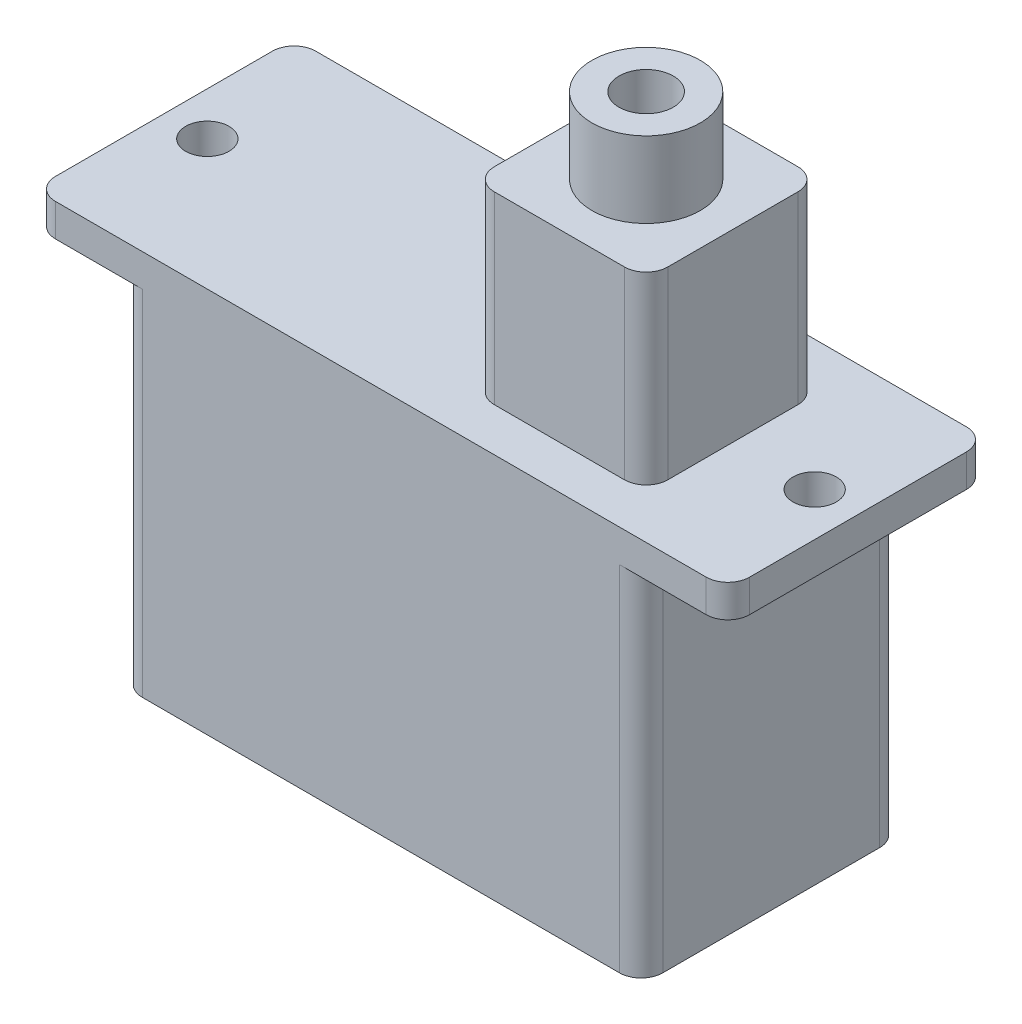
ISO-10303-21;
HEADER;
FILE_DESCRIPTION(('STEP AP214'),'2;1');
FILE_NAME('part.step','',(''),(''),'','','');
FILE_SCHEMA(('AUTOMOTIVE_DESIGN { 1 0 10303 214 1 1 1 1 }'));
ENDSEC;
DATA;
#1=APPLICATION_CONTEXT('core data for automotive mechanical design processes');
#2=APPLICATION_PROTOCOL_DEFINITION('international standard','automotive_design',2000,#1);
#3=PRODUCT_CONTEXT('',#1,'mechanical');
#4=PRODUCT('Part','Part','',(#3));
#5=PRODUCT_RELATED_PRODUCT_CATEGORY('part','',(#4));
#6=PRODUCT_DEFINITION_FORMATION('','',#4);
#7=PRODUCT_DEFINITION_CONTEXT('part definition',#1,'design');
#8=PRODUCT_DEFINITION('design','',#6,#7);
#9=PRODUCT_DEFINITION_SHAPE('','',#8);
#10=(LENGTH_UNIT() NAMED_UNIT(*) SI_UNIT(.MILLI.,.METRE.));
#11=(NAMED_UNIT(*) PLANE_ANGLE_UNIT() SI_UNIT($,.RADIAN.));
#12=(NAMED_UNIT(*) SI_UNIT($,.STERADIAN.) SOLID_ANGLE_UNIT());
#13=UNCERTAINTY_MEASURE_WITH_UNIT(LENGTH_MEASURE(1.E-05),#10,'distance_accuracy_value','');
#14=(GEOMETRIC_REPRESENTATION_CONTEXT(3) GLOBAL_UNCERTAINTY_ASSIGNED_CONTEXT((#13)) GLOBAL_UNIT_ASSIGNED_CONTEXT((#10,
#11,#12)) REPRESENTATION_CONTEXT('',''));
#15=CARTESIAN_POINT('',(0.,0.,0.));
#16=DIRECTION('',(0.,0.,1.));
#17=DIRECTION('',(1.,0.,0.));
#18=AXIS2_PLACEMENT_3D('',#15,#16,#17);
#19=CARTESIAN_POINT('',(12.,16.3,-6.));
#20=DIRECTION('',(-1.,0.,0.));
#21=DIRECTION('',(0.,0.,1.));
#22=AXIS2_PLACEMENT_3D('',#19,#20,#21);
#23=PLANE('',#22);
#24=DIRECTION('',(0.,0.,-1.));
#25=VECTOR('',#24,1.);
#26=CARTESIAN_POINT('',(12.,0.,-6.));
#27=LINE('',#26,#25);
#28=CARTESIAN_POINT('',(12.,0.,5.));
#29=VERTEX_POINT('',#28);
#30=CARTESIAN_POINT('',(12.,0.,-5.));
#31=VERTEX_POINT('',#30);
#32=EDGE_CURVE('E348',#29,#31,#27,.T.);
#33=ORIENTED_EDGE('',*,*,#32,.T.);
#34=DIRECTION('',(0.,-1.,0.));
#35=VECTOR('',#34,1.);
#36=CARTESIAN_POINT('',(12.,16.3,-5.));
#37=LINE('',#36,#35);
#38=CARTESIAN_POINT('',(12.,16.3,-5.));
#39=VERTEX_POINT('',#38);
#40=EDGE_CURVE('E58',#31,#39,#37,.F.);
#41=ORIENTED_EDGE('',*,*,#40,.T.);
#42=DIRECTION('',(0.,0.,-1.));
#43=VECTOR('',#42,1.);
#44=CARTESIAN_POINT('',(12.,16.3,-6.));
#45=LINE('',#44,#43);
#46=CARTESIAN_POINT('',(12.,16.3,5.));
#47=VERTEX_POINT('',#46);
#48=EDGE_CURVE('E338',#47,#39,#45,.T.);
#49=ORIENTED_EDGE('',*,*,#48,.F.);
#50=DIRECTION('',(0.,-1.,0.));
#51=VECTOR('',#50,1.);
#52=CARTESIAN_POINT('',(12.,16.3,5.));
#53=LINE('',#52,#51);
#54=EDGE_CURVE('E325',#47,#29,#53,.T.);
#55=ORIENTED_EDGE('',*,*,#54,.T.);
#56=EDGE_LOOP('',(#33,#41,#49,#55));
#57=FACE_BOUND('',#56,.T.);
#58=ADVANCED_FACE('F43',(#57),#23,.F.);
#59=CARTESIAN_POINT('',(-12.,16.3,-6.));
#60=DIRECTION('',(0.,0.,1.));
#61=DIRECTION('',(1.,0.,0.));
#62=AXIS2_PLACEMENT_3D('',#59,#60,#61);
#63=PLANE('',#62);
#64=DIRECTION('',(-1.,0.,0.));
#65=VECTOR('',#64,1.);
#66=CARTESIAN_POINT('',(-12.,0.,-6.));
#67=LINE('',#66,#65);
#68=CARTESIAN_POINT('',(11.,0.,-6.));
#69=VERTEX_POINT('',#68);
#70=CARTESIAN_POINT('',(-11.,0.,-6.));
#71=VERTEX_POINT('',#70);
#72=EDGE_CURVE('E342',#69,#71,#67,.T.);
#73=ORIENTED_EDGE('',*,*,#72,.T.);
#74=DIRECTION('',(0.,-1.,0.));
#75=VECTOR('',#74,1.);
#76=CARTESIAN_POINT('',(-11.,16.3,-6.));
#77=LINE('',#76,#75);
#78=CARTESIAN_POINT('',(-11.,16.3,-6.));
#79=VERTEX_POINT('',#78);
#80=EDGE_CURVE('E223',#71,#79,#77,.F.);
#81=ORIENTED_EDGE('',*,*,#80,.T.);
#82=DIRECTION('',(-1.,0.,0.));
#83=VECTOR('',#82,1.);
#84=CARTESIAN_POINT('',(0.,16.3,-6.));
#85=LINE('',#84,#83);
#86=CARTESIAN_POINT('',(-15.,16.3,-6.));
#87=VERTEX_POINT('',#86);
#88=EDGE_CURVE('E205',#79,#87,#85,.T.);
#89=ORIENTED_EDGE('',*,*,#88,.T.);
#90=DIRECTION('',(0.,-1.,0.));
#91=VECTOR('',#90,1.);
#92=CARTESIAN_POINT('',(-15.,16.3,-6.));
#93=LINE('',#92,#91);
#94=CARTESIAN_POINT('',(-15.,17.8,-6.));
#95=VERTEX_POINT('',#94);
#96=EDGE_CURVE('E220',#87,#95,#93,.F.);
#97=ORIENTED_EDGE('',*,*,#96,.T.);
#98=DIRECTION('',(-1.,0.,0.));
#99=VECTOR('',#98,1.);
#100=CARTESIAN_POINT('',(0.,17.8,-6.));
#101=LINE('',#100,#99);
#102=CARTESIAN_POINT('',(15.,17.8,-6.));
#103=VERTEX_POINT('',#102);
#104=EDGE_CURVE('E391',#103,#95,#101,.T.);
#105=ORIENTED_EDGE('',*,*,#104,.F.);
#106=DIRECTION('',(0.,-1.,0.));
#107=VECTOR('',#106,1.);
#108=CARTESIAN_POINT('',(15.,16.3,-6.));
#109=LINE('',#108,#107);
#110=CARTESIAN_POINT('',(15.,16.3,-6.));
#111=VERTEX_POINT('',#110);
#112=EDGE_CURVE('E231',#103,#111,#109,.T.);
#113=ORIENTED_EDGE('',*,*,#112,.T.);
#114=CARTESIAN_POINT('',(11.,16.3,-6.));
#115=VERTEX_POINT('',#114);
#116=EDGE_CURVE('E225',#111,#115,#85,.T.);
#117=ORIENTED_EDGE('',*,*,#116,.T.);
#118=DIRECTION('',(0.,-1.,0.));
#119=VECTOR('',#118,1.);
#120=CARTESIAN_POINT('',(11.,16.3,-6.));
#121=LINE('',#120,#119);
#122=EDGE_CURVE('E315',#115,#69,#121,.T.);
#123=ORIENTED_EDGE('',*,*,#122,.T.);
#124=EDGE_LOOP('',(#73,#81,#89,#97,#105,#113,#117,#123));
#125=FACE_BOUND('',#124,.T.);
#126=ADVANCED_FACE('F218',(#125),#63,.F.);
#127=CARTESIAN_POINT('',(-12.,16.3,-6.));
#128=DIRECTION('',(1.,0.,0.));
#129=DIRECTION('',(0.,0.,-1.));
#130=AXIS2_PLACEMENT_3D('',#127,#128,#129);
#131=PLANE('',#130);
#132=DIRECTION('',(0.,0.,1.));
#133=VECTOR('',#132,1.);
#134=CARTESIAN_POINT('',(-12.,16.3,-6.));
#135=LINE('',#134,#133);
#136=CARTESIAN_POINT('',(-12.,16.3,-5.));
#137=VERTEX_POINT('',#136);
#138=CARTESIAN_POINT('',(-12.,16.3,5.));
#139=VERTEX_POINT('',#138);
#140=EDGE_CURVE('E238',#137,#139,#135,.T.);
#141=ORIENTED_EDGE('',*,*,#140,.F.);
#142=DIRECTION('',(0.,-1.,0.));
#143=VECTOR('',#142,1.);
#144=CARTESIAN_POINT('',(-12.,16.3,-5.));
#145=LINE('',#144,#143);
#146=CARTESIAN_POINT('',(-12.,0.,-5.));
#147=VERTEX_POINT('',#146);
#148=EDGE_CURVE('E304',#137,#147,#145,.T.);
#149=ORIENTED_EDGE('',*,*,#148,.T.);
#150=DIRECTION('',(0.,0.,1.));
#151=VECTOR('',#150,1.);
#152=CARTESIAN_POINT('',(-12.,0.,-6.));
#153=LINE('',#152,#151);
#154=CARTESIAN_POINT('',(-12.,0.,5.));
#155=VERTEX_POINT('',#154);
#156=EDGE_CURVE('E347',#147,#155,#153,.T.);
#157=ORIENTED_EDGE('',*,*,#156,.T.);
#158=DIRECTION('',(0.,-1.,0.));
#159=VECTOR('',#158,1.);
#160=CARTESIAN_POINT('',(-12.,16.3,5.));
#161=LINE('',#160,#159);
#162=EDGE_CURVE('E302',#155,#139,#161,.F.);
#163=ORIENTED_EDGE('',*,*,#162,.T.);
#164=EDGE_LOOP('',(#141,#149,#157,#163));
#165=FACE_BOUND('',#164,.T.);
#166=ADVANCED_FACE('F444',(#165),#131,.F.);
#167=CARTESIAN_POINT('',(-12.,16.3,6.));
#168=DIRECTION('',(0.,0.,-1.));
#169=DIRECTION('',(-1.,0.,0.));
#170=AXIS2_PLACEMENT_3D('',#167,#168,#169);
#171=PLANE('',#170);
#172=DIRECTION('',(1.,0.,0.));
#173=VECTOR('',#172,1.);
#174=CARTESIAN_POINT('',(0.,16.3,6.));
#175=LINE('',#174,#173);
#176=CARTESIAN_POINT('',(-15.,16.3,6.));
#177=VERTEX_POINT('',#176);
#178=CARTESIAN_POINT('',(-11.,16.3,6.));
#179=VERTEX_POINT('',#178);
#180=EDGE_CURVE('E413',#177,#179,#175,.T.);
#181=ORIENTED_EDGE('',*,*,#180,.T.);
#182=DIRECTION('',(0.,-1.,0.));
#183=VECTOR('',#182,1.);
#184=CARTESIAN_POINT('',(-11.,16.3,6.));
#185=LINE('',#184,#183);
#186=CARTESIAN_POINT('',(-11.,0.,6.));
#187=VERTEX_POINT('',#186);
#188=EDGE_CURVE('E322',#179,#187,#185,.T.);
#189=ORIENTED_EDGE('',*,*,#188,.T.);
#190=DIRECTION('',(1.,0.,0.));
#191=VECTOR('',#190,1.);
#192=CARTESIAN_POINT('',(-12.,0.,6.));
#193=LINE('',#192,#191);
#194=CARTESIAN_POINT('',(11.,0.,6.));
#195=VERTEX_POINT('',#194);
#196=EDGE_CURVE('E351',#187,#195,#193,.T.);
#197=ORIENTED_EDGE('',*,*,#196,.T.);
#198=DIRECTION('',(0.,-1.,0.));
#199=VECTOR('',#198,1.);
#200=CARTESIAN_POINT('',(11.,16.3,6.));
#201=LINE('',#200,#199);
#202=CARTESIAN_POINT('',(11.,16.3,6.));
#203=VERTEX_POINT('',#202);
#204=EDGE_CURVE('E319',#195,#203,#201,.F.);
#205=ORIENTED_EDGE('',*,*,#204,.T.);
#206=CARTESIAN_POINT('',(15.,16.3,6.));
#207=VERTEX_POINT('',#206);
#208=EDGE_CURVE('E383',#203,#207,#175,.T.);
#209=ORIENTED_EDGE('',*,*,#208,.T.);
#210=DIRECTION('',(0.,-1.,0.));
#211=VECTOR('',#210,1.);
#212=CARTESIAN_POINT('',(15.,17.8,6.));
#213=LINE('',#212,#211);
#214=CARTESIAN_POINT('',(15.,17.8,6.));
#215=VERTEX_POINT('',#214);
#216=EDGE_CURVE('E260',#207,#215,#213,.F.);
#217=ORIENTED_EDGE('',*,*,#216,.T.);
#218=DIRECTION('',(1.,0.,0.));
#219=VECTOR('',#218,1.);
#220=CARTESIAN_POINT('',(0.,17.8,6.));
#221=LINE('',#220,#219);
#222=CARTESIAN_POINT('',(-15.,17.8,6.));
#223=VERTEX_POINT('',#222);
#224=EDGE_CURVE('E384',#223,#215,#221,.T.);
#225=ORIENTED_EDGE('',*,*,#224,.F.);
#226=DIRECTION('',(0.,-1.,0.));
#227=VECTOR('',#226,1.);
#228=CARTESIAN_POINT('',(-15.,16.3,6.));
#229=LINE('',#228,#227);
#230=EDGE_CURVE('E257',#223,#177,#229,.T.);
#231=ORIENTED_EDGE('',*,*,#230,.T.);
#232=EDGE_LOOP('',(#181,#189,#197,#205,#209,#217,#225,#231));
#233=FACE_BOUND('',#232,.T.);
#234=ADVANCED_FACE('F435',(#233),#171,.F.);
#235=CARTESIAN_POINT('',(0.,0.,0.));
#236=DIRECTION('',(0.,1.,0.));
#237=DIRECTION('',(0.,0.,1.));
#238=AXIS2_PLACEMENT_3D('',#235,#236,#237);
#239=PLANE('',#238);
#240=ORIENTED_EDGE('',*,*,#156,.F.);
#241=CARTESIAN_POINT('',(-11.,0.,-5.));
#242=DIRECTION('',(0.,1.,0.));
#243=DIRECTION('',(0.,0.,1.));
#244=AXIS2_PLACEMENT_3D('',#241,#242,#243);
#245=CIRCLE('',#244,1.);
#246=EDGE_CURVE('E313',#147,#71,#245,.F.);
#247=ORIENTED_EDGE('',*,*,#246,.T.);
#248=ORIENTED_EDGE('',*,*,#72,.F.);
#249=CARTESIAN_POINT('',(11.,0.,-5.));
#250=DIRECTION('',(0.,1.,0.));
#251=DIRECTION('',(0.,0.,1.));
#252=AXIS2_PLACEMENT_3D('',#249,#250,#251);
#253=CIRCLE('',#252,1.);
#254=EDGE_CURVE('E309',#69,#31,#253,.F.);
#255=ORIENTED_EDGE('',*,*,#254,.T.);
#256=ORIENTED_EDGE('',*,*,#32,.F.);
#257=CARTESIAN_POINT('',(11.,0.,5.));
#258=DIRECTION('',(0.,1.,0.));
#259=DIRECTION('',(0.,0.,1.));
#260=AXIS2_PLACEMENT_3D('',#257,#258,#259);
#261=CIRCLE('',#260,1.);
#262=EDGE_CURVE('E307',#29,#195,#261,.F.);
#263=ORIENTED_EDGE('',*,*,#262,.T.);
#264=ORIENTED_EDGE('',*,*,#196,.F.);
#265=CARTESIAN_POINT('',(-11.,0.,5.));
#266=DIRECTION('',(0.,1.,0.));
#267=DIRECTION('',(0.,0.,1.));
#268=AXIS2_PLACEMENT_3D('',#265,#266,#267);
#269=CIRCLE('',#268,1.);
#270=EDGE_CURVE('E311',#187,#155,#269,.F.);
#271=ORIENTED_EDGE('',*,*,#270,.T.);
#272=EDGE_LOOP('',(#240,#247,#248,#255,#256,#263,#264,#271));
#273=FACE_BOUND('',#272,.T.);
#274=ADVANCED_FACE('F345',(#273),#239,.F.);
#275=CARTESIAN_POINT('',(0.,16.3,0.));
#276=DIRECTION('',(0.,1.,0.));
#277=DIRECTION('',(0.,0.,1.));
#278=AXIS2_PLACEMENT_3D('',#275,#276,#277);
#279=PLANE('',#278);
#280=CARTESIAN_POINT('',(14.,16.3,0.));
#281=DIRECTION('',(0.,1.,0.));
#282=DIRECTION('',(0.,0.,1.));
#283=AXIS2_PLACEMENT_3D('',#280,#281,#282);
#284=CIRCLE('',#283,1.);
#285=CARTESIAN_POINT('',(14.,16.3,1.));
#286=VERTEX_POINT('',#285);
#287=EDGE_CURVE('E388',#286,#286,#284,.T.);
#288=ORIENTED_EDGE('',*,*,#287,.T.);
#289=EDGE_LOOP('',(#288));
#290=FACE_BOUND('',#289,.T.);
#291=ORIENTED_EDGE('',*,*,#116,.F.);
#292=CARTESIAN_POINT('',(15.,16.3,-5.));
#293=DIRECTION('',(0.,1.,0.));
#294=DIRECTION('',(0.,0.,1.));
#295=AXIS2_PLACEMENT_3D('',#292,#293,#294);
#296=CIRCLE('',#295,1.);
#297=CARTESIAN_POINT('',(16.,16.3,-5.));
#298=VERTEX_POINT('',#297);
#299=EDGE_CURVE('E243',#111,#298,#296,.F.);
#300=ORIENTED_EDGE('',*,*,#299,.T.);
#301=DIRECTION('',(0.,0.,1.));
#302=VECTOR('',#301,1.);
#303=CARTESIAN_POINT('',(16.,16.3,0.));
#304=LINE('',#303,#302);
#305=CARTESIAN_POINT('',(16.,16.3,5.));
#306=VERTEX_POINT('',#305);
#307=EDGE_CURVE('E226',#298,#306,#304,.T.);
#308=ORIENTED_EDGE('',*,*,#307,.T.);
#309=CARTESIAN_POINT('',(15.,16.3,5.));
#310=DIRECTION('',(0.,1.,0.));
#311=DIRECTION('',(0.,0.,1.));
#312=AXIS2_PLACEMENT_3D('',#309,#310,#311);
#313=CIRCLE('',#312,1.);
#314=EDGE_CURVE('E235',#306,#207,#313,.F.);
#315=ORIENTED_EDGE('',*,*,#314,.T.);
#316=ORIENTED_EDGE('',*,*,#208,.F.);
#317=CARTESIAN_POINT('',(11.,16.3,5.));
#318=DIRECTION('',(0.,1.,0.));
#319=DIRECTION('',(0.,0.,1.));
#320=AXIS2_PLACEMENT_3D('',#317,#318,#319);
#321=CIRCLE('',#320,1.);
#322=EDGE_CURVE('E11',#203,#47,#321,.T.);
#323=ORIENTED_EDGE('',*,*,#322,.T.);
#324=ORIENTED_EDGE('',*,*,#48,.T.);
#325=CARTESIAN_POINT('',(11.,16.3,-5.));
#326=DIRECTION('',(0.,1.,0.));
#327=DIRECTION('',(0.,0.,1.));
#328=AXIS2_PLACEMENT_3D('',#325,#326,#327);
#329=CIRCLE('',#328,1.);
#330=EDGE_CURVE('E51',#39,#115,#329,.T.);
#331=ORIENTED_EDGE('',*,*,#330,.T.);
#332=EDGE_LOOP('',(#291,#300,#308,#315,#316,#323,#324,#331));
#333=FACE_BOUND('',#332,.T.);
#334=ADVANCED_FACE('F337',(#290,#333),#279,.F.);
#335=CARTESIAN_POINT('',(-14.,16.3,0.));
#336=DIRECTION('',(0.,1.,0.));
#337=DIRECTION('',(0.,0.,1.));
#338=AXIS2_PLACEMENT_3D('',#335,#336,#337);
#339=CIRCLE('',#338,1.);
#340=CARTESIAN_POINT('',(-14.,16.3,1.));
#341=VERTEX_POINT('',#340);
#342=EDGE_CURVE('E418',#341,#341,#339,.T.);
#343=ORIENTED_EDGE('',*,*,#342,.T.);
#344=EDGE_LOOP('',(#343));
#345=FACE_BOUND('',#344,.T.);
#346=DIRECTION('',(0.,0.,1.));
#347=VECTOR('',#346,1.);
#348=CARTESIAN_POINT('',(-16.,16.3,0.));
#349=LINE('',#348,#347);
#350=CARTESIAN_POINT('',(-16.,16.3,-5.));
#351=VERTEX_POINT('',#350);
#352=CARTESIAN_POINT('',(-16.,16.3,5.));
#353=VERTEX_POINT('',#352);
#354=EDGE_CURVE('E208',#351,#353,#349,.T.);
#355=ORIENTED_EDGE('',*,*,#354,.F.);
#356=CARTESIAN_POINT('',(-15.,16.3,-5.));
#357=DIRECTION('',(0.,1.,0.));
#358=DIRECTION('',(0.,0.,1.));
#359=AXIS2_PLACEMENT_3D('',#356,#357,#358);
#360=CIRCLE('',#359,1.);
#361=EDGE_CURVE('E202',#351,#87,#360,.F.);
#362=ORIENTED_EDGE('',*,*,#361,.T.);
#363=ORIENTED_EDGE('',*,*,#88,.F.);
#364=CARTESIAN_POINT('',(-11.,16.3,-5.));
#365=DIRECTION('',(0.,1.,0.));
#366=DIRECTION('',(0.,0.,1.));
#367=AXIS2_PLACEMENT_3D('',#364,#365,#366);
#368=CIRCLE('',#367,1.);
#369=EDGE_CURVE('E329',#79,#137,#368,.T.);
#370=ORIENTED_EDGE('',*,*,#369,.T.);
#371=ORIENTED_EDGE('',*,*,#140,.T.);
#372=CARTESIAN_POINT('',(-11.,16.3,5.));
#373=DIRECTION('',(0.,1.,0.));
#374=DIRECTION('',(0.,0.,1.));
#375=AXIS2_PLACEMENT_3D('',#372,#373,#374);
#376=CIRCLE('',#375,1.);
#377=EDGE_CURVE('E331',#139,#179,#376,.T.);
#378=ORIENTED_EDGE('',*,*,#377,.T.);
#379=ORIENTED_EDGE('',*,*,#180,.F.);
#380=CARTESIAN_POINT('',(-15.,16.3,5.));
#381=DIRECTION('',(0.,1.,0.));
#382=DIRECTION('',(0.,0.,1.));
#383=AXIS2_PLACEMENT_3D('',#380,#381,#382);
#384=CIRCLE('',#383,1.);
#385=EDGE_CURVE('E214',#177,#353,#384,.F.);
#386=ORIENTED_EDGE('',*,*,#385,.T.);
#387=EDGE_LOOP('',(#355,#362,#363,#370,#371,#378,#379,#386));
#388=FACE_BOUND('',#387,.T.);
#389=ADVANCED_FACE('F204',(#345,#388),#279,.F.);
#390=CARTESIAN_POINT('',(16.,17.8,0.));
#391=DIRECTION('',(1.,0.,0.));
#392=DIRECTION('',(0.,0.,-1.));
#393=AXIS2_PLACEMENT_3D('',#390,#391,#392);
#394=PLANE('',#393);
#395=ORIENTED_EDGE('',*,*,#307,.F.);
#396=DIRECTION('',(0.,-1.,0.));
#397=VECTOR('',#396,1.);
#398=CARTESIAN_POINT('',(16.,17.8,-5.));
#399=LINE('',#398,#397);
#400=CARTESIAN_POINT('',(16.,17.8,-5.));
#401=VERTEX_POINT('',#400);
#402=EDGE_CURVE('E248',#298,#401,#399,.F.);
#403=ORIENTED_EDGE('',*,*,#402,.T.);
#404=DIRECTION('',(0.,0.,1.));
#405=VECTOR('',#404,1.);
#406=CARTESIAN_POINT('',(16.,17.8,0.));
#407=LINE('',#406,#405);
#408=CARTESIAN_POINT('',(16.,17.8,5.));
#409=VERTEX_POINT('',#408);
#410=EDGE_CURVE('E387',#401,#409,#407,.T.);
#411=ORIENTED_EDGE('',*,*,#410,.T.);
#412=DIRECTION('',(0.,-1.,0.));
#413=VECTOR('',#412,1.);
#414=CARTESIAN_POINT('',(16.,16.3,5.));
#415=LINE('',#414,#413);
#416=EDGE_CURVE('E245',#409,#306,#415,.T.);
#417=ORIENTED_EDGE('',*,*,#416,.T.);
#418=EDGE_LOOP('',(#395,#403,#411,#417));
#419=FACE_BOUND('',#418,.T.);
#420=ADVANCED_FACE('F684',(#419),#394,.T.);
#421=CARTESIAN_POINT('',(-14.,17.8,0.));
#422=DIRECTION('',(0.,-1.,0.));
#423=DIRECTION('',(0.,0.,-1.));
#424=AXIS2_PLACEMENT_3D('',#421,#422,#423);
#425=CYLINDRICAL_SURFACE('',#424,1.);
#426=CARTESIAN_POINT('',(-14.,17.8,0.));
#427=DIRECTION('',(0.,1.,0.));
#428=DIRECTION('',(0.,0.,1.));
#429=AXIS2_PLACEMENT_3D('',#426,#427,#428);
#430=CIRCLE('',#429,1.);
#431=CARTESIAN_POINT('',(-14.,17.8,1.));
#432=VERTEX_POINT('',#431);
#433=EDGE_CURVE('E408',#432,#432,#430,.T.);
#434=ORIENTED_EDGE('',*,*,#433,.T.);
#435=EDGE_LOOP('',(#434));
#436=FACE_BOUND('',#435,.T.);
#437=ORIENTED_EDGE('',*,*,#342,.F.);
#438=EDGE_LOOP('',(#437));
#439=FACE_BOUND('',#438,.T.);
#440=ADVANCED_FACE('F675',(#436,#439),#425,.F.);
#441=CARTESIAN_POINT('',(-16.,17.8,0.));
#442=DIRECTION('',(1.,0.,0.));
#443=DIRECTION('',(0.,0.,-1.));
#444=AXIS2_PLACEMENT_3D('',#441,#442,#443);
#445=PLANE('',#444);
#446=DIRECTION('',(0.,0.,1.));
#447=VECTOR('',#446,1.);
#448=CARTESIAN_POINT('',(-16.,17.8,0.));
#449=LINE('',#448,#447);
#450=CARTESIAN_POINT('',(-16.,17.8,-5.));
#451=VERTEX_POINT('',#450);
#452=CARTESIAN_POINT('',(-16.,17.8,5.));
#453=VERTEX_POINT('',#452);
#454=EDGE_CURVE('E393',#451,#453,#449,.T.);
#455=ORIENTED_EDGE('',*,*,#454,.F.);
#456=DIRECTION('',(0.,-1.,0.));
#457=VECTOR('',#456,1.);
#458=CARTESIAN_POINT('',(-16.,17.8,-5.));
#459=LINE('',#458,#457);
#460=EDGE_CURVE('E264',#451,#351,#459,.T.);
#461=ORIENTED_EDGE('',*,*,#460,.T.);
#462=ORIENTED_EDGE('',*,*,#354,.T.);
#463=DIRECTION('',(0.,-1.,0.));
#464=VECTOR('',#463,1.);
#465=CARTESIAN_POINT('',(-16.,17.8,5.));
#466=LINE('',#465,#464);
#467=EDGE_CURVE('E262',#353,#453,#466,.F.);
#468=ORIENTED_EDGE('',*,*,#467,.T.);
#469=EDGE_LOOP('',(#455,#461,#462,#468));
#470=FACE_BOUND('',#469,.T.);
#471=ADVANCED_FACE('F665',(#470),#445,.F.);
#472=CARTESIAN_POINT('',(14.,17.8,0.));
#473=DIRECTION('',(0.,-1.,0.));
#474=DIRECTION('',(0.,0.,-1.));
#475=AXIS2_PLACEMENT_3D('',#472,#473,#474);
#476=CYLINDRICAL_SURFACE('',#475,1.);
#477=CARTESIAN_POINT('',(14.,17.8,0.));
#478=DIRECTION('',(0.,1.,0.));
#479=DIRECTION('',(0.,0.,1.));
#480=AXIS2_PLACEMENT_3D('',#477,#478,#479);
#481=CIRCLE('',#480,1.);
#482=CARTESIAN_POINT('',(14.,17.8,1.));
#483=VERTEX_POINT('',#482);
#484=EDGE_CURVE('E353',#483,#483,#481,.T.);
#485=ORIENTED_EDGE('',*,*,#484,.T.);
#486=EDGE_LOOP('',(#485));
#487=FACE_BOUND('',#486,.T.);
#488=ORIENTED_EDGE('',*,*,#287,.F.);
#489=EDGE_LOOP('',(#488));
#490=FACE_BOUND('',#489,.T.);
#491=ADVANCED_FACE('F656',(#487,#490),#476,.F.);
#492=CARTESIAN_POINT('',(0.,17.8,0.));
#493=DIRECTION('',(0.,1.,0.));
#494=DIRECTION('',(0.,0.,1.));
#495=AXIS2_PLACEMENT_3D('',#492,#493,#494);
#496=PLANE('',#495);
#497=ORIENTED_EDGE('',*,*,#410,.F.);
#498=CARTESIAN_POINT('',(15.,17.8,-5.));
#499=DIRECTION('',(0.,1.,0.));
#500=DIRECTION('',(0.,0.,1.));
#501=AXIS2_PLACEMENT_3D('',#498,#499,#500);
#502=CIRCLE('',#501,1.);
#503=EDGE_CURVE('E255',#401,#103,#502,.T.);
#504=ORIENTED_EDGE('',*,*,#503,.T.);
#505=ORIENTED_EDGE('',*,*,#104,.T.);
#506=CARTESIAN_POINT('',(-15.,17.8,-5.));
#507=DIRECTION('',(0.,1.,0.));
#508=DIRECTION('',(0.,0.,1.));
#509=AXIS2_PLACEMENT_3D('',#506,#507,#508);
#510=CIRCLE('',#509,1.);
#511=EDGE_CURVE('E230',#95,#451,#510,.T.);
#512=ORIENTED_EDGE('',*,*,#511,.T.);
#513=ORIENTED_EDGE('',*,*,#454,.T.);
#514=CARTESIAN_POINT('',(-15.,17.8,5.));
#515=DIRECTION('',(0.,1.,0.));
#516=DIRECTION('',(0.,0.,1.));
#517=AXIS2_PLACEMENT_3D('',#514,#515,#516);
#518=CIRCLE('',#517,1.);
#519=EDGE_CURVE('E250',#453,#223,#518,.T.);
#520=ORIENTED_EDGE('',*,*,#519,.T.);
#521=ORIENTED_EDGE('',*,*,#224,.T.);
#522=CARTESIAN_POINT('',(15.,17.8,5.));
#523=DIRECTION('',(0.,1.,0.));
#524=DIRECTION('',(0.,0.,1.));
#525=AXIS2_PLACEMENT_3D('',#522,#523,#524);
#526=CIRCLE('',#525,1.);
#527=EDGE_CURVE('E253',#215,#409,#526,.T.);
#528=ORIENTED_EDGE('',*,*,#527,.T.);
#529=EDGE_LOOP('',(#497,#504,#505,#512,#513,#520,#521,#528));
#530=FACE_BOUND('',#529,.T.);
#531=DIRECTION('',(0.,0.,1.));
#532=VECTOR('',#531,1.);
#533=CARTESIAN_POINT('',(2.23,17.8,0.));
#534=LINE('',#533,#532);
#535=CARTESIAN_POINT('',(2.23,17.8,-3.));
#536=VERTEX_POINT('',#535);
#537=CARTESIAN_POINT('',(2.23,17.8,3.));
#538=VERTEX_POINT('',#537);
#539=EDGE_CURVE('E405',#536,#538,#534,.T.);
#540=ORIENTED_EDGE('',*,*,#539,.F.);
#541=CARTESIAN_POINT('',(3.23,17.8,-3.));
#542=DIRECTION('',(0.,1.,0.));
#543=DIRECTION('',(0.,0.,1.));
#544=AXIS2_PLACEMENT_3D('',#541,#542,#543);
#545=CIRCLE('',#544,1.);
#546=CARTESIAN_POINT('',(3.23,17.8,-4.));
#547=VERTEX_POINT('',#546);
#548=EDGE_CURVE('E296',#536,#547,#545,.F.);
#549=ORIENTED_EDGE('',*,*,#548,.T.);
#550=DIRECTION('',(1.,0.,0.));
#551=VECTOR('',#550,1.);
#552=CARTESIAN_POINT('',(0.,17.8,-4.));
#553=LINE('',#552,#551);
#554=CARTESIAN_POINT('',(9.23,17.8,-4.));
#555=VERTEX_POINT('',#554);
#556=EDGE_CURVE('E396',#547,#555,#553,.T.);
#557=ORIENTED_EDGE('',*,*,#556,.T.);
#558=CARTESIAN_POINT('',(9.23,17.8,-3.));
#559=DIRECTION('',(0.,1.,0.));
#560=DIRECTION('',(0.,0.,1.));
#561=AXIS2_PLACEMENT_3D('',#558,#559,#560);
#562=CIRCLE('',#561,1.);
#563=CARTESIAN_POINT('',(10.23,17.8,-3.));
#564=VERTEX_POINT('',#563);
#565=EDGE_CURVE('E294',#555,#564,#562,.F.);
#566=ORIENTED_EDGE('',*,*,#565,.T.);
#567=DIRECTION('',(0.,0.,1.));
#568=VECTOR('',#567,1.);
#569=CARTESIAN_POINT('',(10.23,17.8,0.));
#570=LINE('',#569,#568);
#571=CARTESIAN_POINT('',(10.23,17.8,3.));
#572=VERTEX_POINT('',#571);
#573=EDGE_CURVE('E399',#564,#572,#570,.T.);
#574=ORIENTED_EDGE('',*,*,#573,.T.);
#575=CARTESIAN_POINT('',(9.23,17.8,3.));
#576=DIRECTION('',(0.,1.,0.));
#577=DIRECTION('',(0.,0.,1.));
#578=AXIS2_PLACEMENT_3D('',#575,#576,#577);
#579=CIRCLE('',#578,1.);
#580=CARTESIAN_POINT('',(9.23,17.8,4.));
#581=VERTEX_POINT('',#580);
#582=EDGE_CURVE('E300',#572,#581,#579,.F.);
#583=ORIENTED_EDGE('',*,*,#582,.T.);
#584=DIRECTION('',(1.,0.,0.));
#585=VECTOR('',#584,1.);
#586=CARTESIAN_POINT('',(0.,17.8,4.));
#587=LINE('',#586,#585);
#588=CARTESIAN_POINT('',(3.23,17.8,4.));
#589=VERTEX_POINT('',#588);
#590=EDGE_CURVE('E402',#589,#581,#587,.T.);
#591=ORIENTED_EDGE('',*,*,#590,.F.);
#592=CARTESIAN_POINT('',(3.23,17.8,3.));
#593=DIRECTION('',(0.,1.,0.));
#594=DIRECTION('',(0.,0.,1.));
#595=AXIS2_PLACEMENT_3D('',#592,#593,#594);
#596=CIRCLE('',#595,1.);
#597=EDGE_CURVE('E298',#589,#538,#596,.F.);
#598=ORIENTED_EDGE('',*,*,#597,.T.);
#599=EDGE_LOOP('',(#540,#549,#557,#566,#574,#583,#591,#598));
#600=FACE_BOUND('',#599,.T.);
#601=ORIENTED_EDGE('',*,*,#433,.F.);
#602=EDGE_LOOP('',(#601));
#603=FACE_BOUND('',#602,.T.);
#604=ORIENTED_EDGE('',*,*,#484,.F.);
#605=EDGE_LOOP('',(#604));
#606=FACE_BOUND('',#605,.T.);
#607=ADVANCED_FACE('F647',(#530,#600,#603,#606),#496,.T.);
#608=CARTESIAN_POINT('',(10.23,26.3,0.));
#609=DIRECTION('',(1.,0.,0.));
#610=DIRECTION('',(0.,0.,-1.));
#611=AXIS2_PLACEMENT_3D('',#608,#609,#610);
#612=PLANE('',#611);
#613=ORIENTED_EDGE('',*,*,#573,.F.);
#614=DIRECTION('',(0.,-1.,0.));
#615=VECTOR('',#614,1.);
#616=CARTESIAN_POINT('',(10.23,26.3,-3.));
#617=LINE('',#616,#615);
#618=CARTESIAN_POINT('',(10.23,26.3,-3.));
#619=VERTEX_POINT('',#618);
#620=EDGE_CURVE('E274',#564,#619,#617,.F.);
#621=ORIENTED_EDGE('',*,*,#620,.T.);
#622=DIRECTION('',(0.,0.,1.));
#623=VECTOR('',#622,1.);
#624=CARTESIAN_POINT('',(10.23,26.3,0.));
#625=LINE('',#624,#623);
#626=CARTESIAN_POINT('',(10.23,26.3,3.));
#627=VERTEX_POINT('',#626);
#628=EDGE_CURVE('E360',#619,#627,#625,.T.);
#629=ORIENTED_EDGE('',*,*,#628,.T.);
#630=DIRECTION('',(0.,-1.,0.));
#631=VECTOR('',#630,1.);
#632=CARTESIAN_POINT('',(10.23,17.8,3.));
#633=LINE('',#632,#631);
#634=EDGE_CURVE('E271',#627,#572,#633,.T.);
#635=ORIENTED_EDGE('',*,*,#634,.T.);
#636=EDGE_LOOP('',(#613,#621,#629,#635));
#637=FACE_BOUND('',#636,.T.);
#638=ADVANCED_FACE('F637',(#637),#612,.T.);
#639=CARTESIAN_POINT('',(0.,26.3,-4.));
#640=DIRECTION('',(0.,0.,-1.));
#641=DIRECTION('',(-1.,0.,0.));
#642=AXIS2_PLACEMENT_3D('',#639,#640,#641);
#643=PLANE('',#642);
#644=DIRECTION('',(1.,0.,0.));
#645=VECTOR('',#644,1.);
#646=CARTESIAN_POINT('',(0.,26.3,-4.));
#647=LINE('',#646,#645);
#648=CARTESIAN_POINT('',(3.23,26.3,-4.));
#649=VERTEX_POINT('',#648);
#650=CARTESIAN_POINT('',(9.23,26.3,-4.));
#651=VERTEX_POINT('',#650);
#652=EDGE_CURVE('E365',#649,#651,#647,.T.);
#653=ORIENTED_EDGE('',*,*,#652,.T.);
#654=DIRECTION('',(0.,-1.,0.));
#655=VECTOR('',#654,1.);
#656=CARTESIAN_POINT('',(9.23,26.3,-4.));
#657=LINE('',#656,#655);
#658=EDGE_CURVE('E268',#651,#555,#657,.T.);
#659=ORIENTED_EDGE('',*,*,#658,.T.);
#660=ORIENTED_EDGE('',*,*,#556,.F.);
#661=DIRECTION('',(0.,-1.,0.));
#662=VECTOR('',#661,1.);
#663=CARTESIAN_POINT('',(3.23,26.3,-4.));
#664=LINE('',#663,#662);
#665=EDGE_CURVE('E213',#547,#649,#664,.F.);
#666=ORIENTED_EDGE('',*,*,#665,.T.);
#667=EDGE_LOOP('',(#653,#659,#660,#666));
#668=FACE_BOUND('',#667,.T.);
#669=ADVANCED_FACE('F627',(#668),#643,.T.);
#670=CARTESIAN_POINT('',(2.23,26.3,0.));
#671=DIRECTION('',(1.,0.,0.));
#672=DIRECTION('',(0.,0.,-1.));
#673=AXIS2_PLACEMENT_3D('',#670,#671,#672);
#674=PLANE('',#673);
#675=DIRECTION('',(0.,0.,1.));
#676=VECTOR('',#675,1.);
#677=CARTESIAN_POINT('',(2.23,26.3,0.));
#678=LINE('',#677,#676);
#679=CARTESIAN_POINT('',(2.23,26.3,-3.));
#680=VERTEX_POINT('',#679);
#681=CARTESIAN_POINT('',(2.23,26.3,3.));
#682=VERTEX_POINT('',#681);
#683=EDGE_CURVE('E377',#680,#682,#678,.T.);
#684=ORIENTED_EDGE('',*,*,#683,.F.);
#685=DIRECTION('',(0.,-1.,0.));
#686=VECTOR('',#685,1.);
#687=CARTESIAN_POINT('',(2.23,17.8,-3.));
#688=LINE('',#687,#686);
#689=EDGE_CURVE('E286',#680,#536,#688,.T.);
#690=ORIENTED_EDGE('',*,*,#689,.T.);
#691=ORIENTED_EDGE('',*,*,#539,.T.);
#692=DIRECTION('',(0.,-1.,0.));
#693=VECTOR('',#692,1.);
#694=CARTESIAN_POINT('',(2.23,26.3,3.));
#695=LINE('',#694,#693);
#696=EDGE_CURVE('E284',#538,#682,#695,.F.);
#697=ORIENTED_EDGE('',*,*,#696,.T.);
#698=EDGE_LOOP('',(#684,#690,#691,#697));
#699=FACE_BOUND('',#698,.T.);
#700=ADVANCED_FACE('F617',(#699),#674,.F.);
#701=CARTESIAN_POINT('',(0.,26.3,4.));
#702=DIRECTION('',(0.,0.,-1.));
#703=DIRECTION('',(-1.,0.,0.));
#704=AXIS2_PLACEMENT_3D('',#701,#702,#703);
#705=PLANE('',#704);
#706=DIRECTION('',(1.,0.,0.));
#707=VECTOR('',#706,1.);
#708=CARTESIAN_POINT('',(0.,26.3,4.));
#709=LINE('',#708,#707);
#710=CARTESIAN_POINT('',(3.23,26.3,4.));
#711=VERTEX_POINT('',#710);
#712=CARTESIAN_POINT('',(9.23,26.3,4.));
#713=VERTEX_POINT('',#712);
#714=EDGE_CURVE('E380',#711,#713,#709,.T.);
#715=ORIENTED_EDGE('',*,*,#714,.F.);
#716=DIRECTION('',(0.,-1.,0.));
#717=VECTOR('',#716,1.);
#718=CARTESIAN_POINT('',(3.23,26.3,4.));
#719=LINE('',#718,#717);
#720=EDGE_CURVE('E291',#711,#589,#719,.T.);
#721=ORIENTED_EDGE('',*,*,#720,.T.);
#722=ORIENTED_EDGE('',*,*,#590,.T.);
#723=DIRECTION('',(0.,-1.,0.));
#724=VECTOR('',#723,1.);
#725=CARTESIAN_POINT('',(9.23,26.3,4.));
#726=LINE('',#725,#724);
#727=EDGE_CURVE('E289',#581,#713,#726,.F.);
#728=ORIENTED_EDGE('',*,*,#727,.T.);
#729=EDGE_LOOP('',(#715,#721,#722,#728));
#730=FACE_BOUND('',#729,.T.);
#731=ADVANCED_FACE('F609',(#730),#705,.F.);
#732=CARTESIAN_POINT('',(0.,26.3,0.));
#733=DIRECTION('',(0.,1.,0.));
#734=DIRECTION('',(0.,0.,1.));
#735=AXIS2_PLACEMENT_3D('',#732,#733,#734);
#736=PLANE('',#735);
#737=CARTESIAN_POINT('',(6.23,26.3,0.));
#738=DIRECTION('',(0.,1.,0.));
#739=DIRECTION('',(0.,0.,1.));
#740=AXIS2_PLACEMENT_3D('',#737,#738,#739);
#741=CIRCLE('',#740,2.5);
#742=CARTESIAN_POINT('',(6.23,26.3,2.5));
#743=VERTEX_POINT('',#742);
#744=EDGE_CURVE('E358',#743,#743,#741,.F.);
#745=ORIENTED_EDGE('',*,*,#744,.T.);
#746=EDGE_LOOP('',(#745));
#747=FACE_BOUND('',#746,.T.);
#748=ORIENTED_EDGE('',*,*,#628,.F.);
#749=CARTESIAN_POINT('',(9.23,26.3,-3.));
#750=DIRECTION('',(0.,1.,0.));
#751=DIRECTION('',(0.,0.,1.));
#752=AXIS2_PLACEMENT_3D('',#749,#750,#751);
#753=CIRCLE('',#752,1.);
#754=EDGE_CURVE('E282',#619,#651,#753,.T.);
#755=ORIENTED_EDGE('',*,*,#754,.T.);
#756=ORIENTED_EDGE('',*,*,#652,.F.);
#757=CARTESIAN_POINT('',(3.23,26.3,-3.));
#758=DIRECTION('',(0.,1.,0.));
#759=DIRECTION('',(0.,0.,1.));
#760=AXIS2_PLACEMENT_3D('',#757,#758,#759);
#761=CIRCLE('',#760,1.);
#762=EDGE_CURVE('E280',#649,#680,#761,.T.);
#763=ORIENTED_EDGE('',*,*,#762,.T.);
#764=ORIENTED_EDGE('',*,*,#683,.T.);
#765=CARTESIAN_POINT('',(3.23,26.3,3.));
#766=DIRECTION('',(0.,1.,0.));
#767=DIRECTION('',(0.,0.,1.));
#768=AXIS2_PLACEMENT_3D('',#765,#766,#767);
#769=CIRCLE('',#768,1.);
#770=EDGE_CURVE('E278',#682,#711,#769,.T.);
#771=ORIENTED_EDGE('',*,*,#770,.T.);
#772=ORIENTED_EDGE('',*,*,#714,.T.);
#773=CARTESIAN_POINT('',(9.23,26.3,3.));
#774=DIRECTION('',(0.,1.,0.));
#775=DIRECTION('',(0.,0.,1.));
#776=AXIS2_PLACEMENT_3D('',#773,#774,#775);
#777=CIRCLE('',#776,1.);
#778=EDGE_CURVE('E276',#713,#627,#777,.T.);
#779=ORIENTED_EDGE('',*,*,#778,.T.);
#780=EDGE_LOOP('',(#748,#755,#756,#763,#764,#771,#772,#779));
#781=FACE_BOUND('',#780,.T.);
#782=ADVANCED_FACE('F571',(#747,#781),#736,.T.);
#783=CARTESIAN_POINT('',(6.23,29.8,0.));
#784=DIRECTION('',(0.,-1.,0.));
#785=DIRECTION('',(0.,0.,-1.));
#786=AXIS2_PLACEMENT_3D('',#783,#784,#785);
#787=CYLINDRICAL_SURFACE('',#786,1.25);
#788=CARTESIAN_POINT('',(6.23,26.3,0.));
#789=DIRECTION('',(0.,1.,0.));
#790=DIRECTION('',(0.,0.,1.));
#791=AXIS2_PLACEMENT_3D('',#788,#789,#790);
#792=CIRCLE('',#791,1.25);
#793=CARTESIAN_POINT('',(6.23,26.3,1.25));
#794=VERTEX_POINT('',#793);
#795=EDGE_CURVE('E232',#794,#794,#792,.F.);
#796=ORIENTED_EDGE('',*,*,#795,.T.);
#797=EDGE_LOOP('',(#796));
#798=FACE_BOUND('',#797,.T.);
#799=CARTESIAN_POINT('',(6.23,29.8,0.));
#800=DIRECTION('',(0.,1.,0.));
#801=DIRECTION('',(0.,0.,1.));
#802=AXIS2_PLACEMENT_3D('',#799,#800,#801);
#803=CIRCLE('',#802,1.25);
#804=CARTESIAN_POINT('',(6.23,29.8,1.25));
#805=VERTEX_POINT('',#804);
#806=EDGE_CURVE('E368',#805,#805,#803,.T.);
#807=ORIENTED_EDGE('',*,*,#806,.T.);
#808=EDGE_LOOP('',(#807));
#809=FACE_BOUND('',#808,.T.);
#810=ADVANCED_FACE('F590',(#798,#809),#787,.F.);
#811=CARTESIAN_POINT('',(6.23,29.8,0.));
#812=DIRECTION('',(0.,-1.,0.));
#813=DIRECTION('',(0.,0.,-1.));
#814=AXIS2_PLACEMENT_3D('',#811,#812,#813);
#815=CYLINDRICAL_SURFACE('',#814,2.5);
#816=ORIENTED_EDGE('',*,*,#744,.F.);
#817=EDGE_LOOP('',(#816));
#818=FACE_BOUND('',#817,.T.);
#819=CARTESIAN_POINT('',(6.23,29.8,0.));
#820=DIRECTION('',(0.,1.,0.));
#821=DIRECTION('',(0.,0.,1.));
#822=AXIS2_PLACEMENT_3D('',#819,#820,#821);
#823=CIRCLE('',#822,2.5);
#824=CARTESIAN_POINT('',(6.23,29.8,2.5));
#825=VERTEX_POINT('',#824);
#826=EDGE_CURVE('E361',#825,#825,#823,.T.);
#827=ORIENTED_EDGE('',*,*,#826,.F.);
#828=EDGE_LOOP('',(#827));
#829=FACE_BOUND('',#828,.T.);
#830=ADVANCED_FACE('F580',(#818,#829),#815,.T.);
#831=CARTESIAN_POINT('',(0.,29.8,0.));
#832=DIRECTION('',(0.,1.,0.));
#833=DIRECTION('',(0.,0.,1.));
#834=AXIS2_PLACEMENT_3D('',#831,#832,#833);
#835=PLANE('',#834);
#836=ORIENTED_EDGE('',*,*,#806,.F.);
#837=EDGE_LOOP('',(#836));
#838=FACE_BOUND('',#837,.T.);
#839=ORIENTED_EDGE('',*,*,#826,.T.);
#840=EDGE_LOOP('',(#839));
#841=FACE_BOUND('',#840,.T.);
#842=ADVANCED_FACE('F568',(#838,#841),#835,.T.);
#843=ORIENTED_EDGE('',*,*,#795,.F.);
#844=EDGE_LOOP('',(#843));
#845=FACE_BOUND('',#844,.T.);
#846=ADVANCED_FACE('F452',(#845),#736,.T.);
#847=CARTESIAN_POINT('',(15.,16.3,-5.));
#848=DIRECTION('',(0.,1.,0.));
#849=DIRECTION('',(0.,0.,1.));
#850=AXIS2_PLACEMENT_3D('',#847,#848,#849);
#851=CYLINDRICAL_SURFACE('',#850,1.);
#852=ORIENTED_EDGE('',*,*,#503,.F.);
#853=ORIENTED_EDGE('',*,*,#402,.F.);
#854=ORIENTED_EDGE('',*,*,#299,.F.);
#855=ORIENTED_EDGE('',*,*,#112,.F.);
#856=EDGE_LOOP('',(#852,#853,#854,#855));
#857=FACE_BOUND('',#856,.T.);
#858=ADVANCED_FACE('F448',(#857),#851,.T.);
#859=CARTESIAN_POINT('',(15.,17.8,5.));
#860=DIRECTION('',(0.,1.,0.));
#861=DIRECTION('',(0.,0.,1.));
#862=AXIS2_PLACEMENT_3D('',#859,#860,#861);
#863=CYLINDRICAL_SURFACE('',#862,1.);
#864=ORIENTED_EDGE('',*,*,#527,.F.);
#865=ORIENTED_EDGE('',*,*,#216,.F.);
#866=ORIENTED_EDGE('',*,*,#314,.F.);
#867=ORIENTED_EDGE('',*,*,#416,.F.);
#868=EDGE_LOOP('',(#864,#865,#866,#867));
#869=FACE_BOUND('',#868,.T.);
#870=ADVANCED_FACE('F451',(#869),#863,.T.);
#871=CARTESIAN_POINT('',(-15.,17.8,-5.));
#872=DIRECTION('',(0.,-1.,0.));
#873=DIRECTION('',(0.,0.,-1.));
#874=AXIS2_PLACEMENT_3D('',#871,#872,#873);
#875=CYLINDRICAL_SURFACE('',#874,1.);
#876=ORIENTED_EDGE('',*,*,#511,.F.);
#877=ORIENTED_EDGE('',*,*,#96,.F.);
#878=ORIENTED_EDGE('',*,*,#361,.F.);
#879=ORIENTED_EDGE('',*,*,#460,.F.);
#880=EDGE_LOOP('',(#876,#877,#878,#879));
#881=FACE_BOUND('',#880,.T.);
#882=ADVANCED_FACE('F229',(#881),#875,.T.);
#883=CARTESIAN_POINT('',(-15.,16.3,5.));
#884=DIRECTION('',(0.,-1.,0.));
#885=DIRECTION('',(0.,0.,-1.));
#886=AXIS2_PLACEMENT_3D('',#883,#884,#885);
#887=CYLINDRICAL_SURFACE('',#886,1.);
#888=ORIENTED_EDGE('',*,*,#519,.F.);
#889=ORIENTED_EDGE('',*,*,#467,.F.);
#890=ORIENTED_EDGE('',*,*,#385,.F.);
#891=ORIENTED_EDGE('',*,*,#230,.F.);
#892=EDGE_LOOP('',(#888,#889,#890,#891));
#893=FACE_BOUND('',#892,.T.);
#894=ADVANCED_FACE('F459',(#893),#887,.T.);
#895=CARTESIAN_POINT('',(9.23,26.3,-3.));
#896=DIRECTION('',(0.,-1.,0.));
#897=DIRECTION('',(0.,0.,-1.));
#898=AXIS2_PLACEMENT_3D('',#895,#896,#897);
#899=CYLINDRICAL_SURFACE('',#898,1.);
#900=ORIENTED_EDGE('',*,*,#754,.F.);
#901=ORIENTED_EDGE('',*,*,#620,.F.);
#902=ORIENTED_EDGE('',*,*,#565,.F.);
#903=ORIENTED_EDGE('',*,*,#658,.F.);
#904=EDGE_LOOP('',(#900,#901,#902,#903));
#905=FACE_BOUND('',#904,.T.);
#906=ADVANCED_FACE('F462',(#905),#899,.T.);
#907=CARTESIAN_POINT('',(3.23,26.3,-3.));
#908=DIRECTION('',(0.,1.,0.));
#909=DIRECTION('',(0.,0.,1.));
#910=AXIS2_PLACEMENT_3D('',#907,#908,#909);
#911=CYLINDRICAL_SURFACE('',#910,1.);
#912=ORIENTED_EDGE('',*,*,#762,.F.);
#913=ORIENTED_EDGE('',*,*,#665,.F.);
#914=ORIENTED_EDGE('',*,*,#548,.F.);
#915=ORIENTED_EDGE('',*,*,#689,.F.);
#916=EDGE_LOOP('',(#912,#913,#914,#915));
#917=FACE_BOUND('',#916,.T.);
#918=ADVANCED_FACE('F466',(#917),#911,.T.);
#919=CARTESIAN_POINT('',(3.23,26.3,3.));
#920=DIRECTION('',(0.,-1.,0.));
#921=DIRECTION('',(0.,0.,-1.));
#922=AXIS2_PLACEMENT_3D('',#919,#920,#921);
#923=CYLINDRICAL_SURFACE('',#922,1.);
#924=ORIENTED_EDGE('',*,*,#770,.F.);
#925=ORIENTED_EDGE('',*,*,#696,.F.);
#926=ORIENTED_EDGE('',*,*,#597,.F.);
#927=ORIENTED_EDGE('',*,*,#720,.F.);
#928=EDGE_LOOP('',(#924,#925,#926,#927));
#929=FACE_BOUND('',#928,.T.);
#930=ADVANCED_FACE('F470',(#929),#923,.T.);
#931=CARTESIAN_POINT('',(9.23,26.3,3.));
#932=DIRECTION('',(0.,1.,0.));
#933=DIRECTION('',(0.,0.,1.));
#934=AXIS2_PLACEMENT_3D('',#931,#932,#933);
#935=CYLINDRICAL_SURFACE('',#934,1.);
#936=ORIENTED_EDGE('',*,*,#778,.F.);
#937=ORIENTED_EDGE('',*,*,#727,.F.);
#938=ORIENTED_EDGE('',*,*,#582,.F.);
#939=ORIENTED_EDGE('',*,*,#634,.F.);
#940=EDGE_LOOP('',(#936,#937,#938,#939));
#941=FACE_BOUND('',#940,.T.);
#942=ADVANCED_FACE('F474',(#941),#935,.T.);
#943=CARTESIAN_POINT('',(-11.,16.3,-5.));
#944=DIRECTION('',(0.,-1.,0.));
#945=DIRECTION('',(0.,0.,-1.));
#946=AXIS2_PLACEMENT_3D('',#943,#944,#945);
#947=CYLINDRICAL_SURFACE('',#946,1.);
#948=ORIENTED_EDGE('',*,*,#369,.F.);
#949=ORIENTED_EDGE('',*,*,#80,.F.);
#950=ORIENTED_EDGE('',*,*,#246,.F.);
#951=ORIENTED_EDGE('',*,*,#148,.F.);
#952=EDGE_LOOP('',(#948,#949,#950,#951));
#953=FACE_BOUND('',#952,.T.);
#954=ADVANCED_FACE('F478',(#953),#947,.T.);
#955=CARTESIAN_POINT('',(-11.,16.3,5.));
#956=DIRECTION('',(0.,-1.,0.));
#957=DIRECTION('',(0.,0.,-1.));
#958=AXIS2_PLACEMENT_3D('',#955,#956,#957);
#959=CYLINDRICAL_SURFACE('',#958,1.);
#960=ORIENTED_EDGE('',*,*,#377,.F.);
#961=ORIENTED_EDGE('',*,*,#162,.F.);
#962=ORIENTED_EDGE('',*,*,#270,.F.);
#963=ORIENTED_EDGE('',*,*,#188,.F.);
#964=EDGE_LOOP('',(#960,#961,#962,#963));
#965=FACE_BOUND('',#964,.T.);
#966=ADVANCED_FACE('F432',(#965),#959,.T.);
#967=CARTESIAN_POINT('',(11.,16.3,-5.));
#968=DIRECTION('',(0.,-1.,0.));
#969=DIRECTION('',(0.,0.,-1.));
#970=AXIS2_PLACEMENT_3D('',#967,#968,#969);
#971=CYLINDRICAL_SURFACE('',#970,1.);
#972=ORIENTED_EDGE('',*,*,#330,.F.);
#973=ORIENTED_EDGE('',*,*,#40,.F.);
#974=ORIENTED_EDGE('',*,*,#254,.F.);
#975=ORIENTED_EDGE('',*,*,#122,.F.);
#976=EDGE_LOOP('',(#972,#973,#974,#975));
#977=FACE_BOUND('',#976,.T.);
#978=ADVANCED_FACE('F340',(#977),#971,.T.);
#979=CARTESIAN_POINT('',(11.,16.3,5.));
#980=DIRECTION('',(0.,-1.,0.));
#981=DIRECTION('',(0.,0.,-1.));
#982=AXIS2_PLACEMENT_3D('',#979,#980,#981);
#983=CYLINDRICAL_SURFACE('',#982,1.);
#984=ORIENTED_EDGE('',*,*,#322,.F.);
#985=ORIENTED_EDGE('',*,*,#204,.F.);
#986=ORIENTED_EDGE('',*,*,#262,.F.);
#987=ORIENTED_EDGE('',*,*,#54,.F.);
#988=EDGE_LOOP('',(#984,#985,#986,#987));
#989=FACE_BOUND('',#988,.T.);
#990=ADVANCED_FACE('F45',(#989),#983,.T.);
#991=CLOSED_SHELL('',(#58,#126,#166,#234,#274,#334,#389,#420,#440,#471,#491,#607,#638,#669,#700,
#731,#782,#810,#830,#842,#846,#858,#870,#882,#894,#906,#918,#930,#942,#954,#966,#978,#990));
#992=MANIFOLD_SOLID_BREP('B2',#991);
#993=ADVANCED_BREP_SHAPE_REPRESENTATION('',(#18,#992),#14);
#994=SHAPE_DEFINITION_REPRESENTATION(#9,#993);
ENDSEC;
END-ISO-10303-21;
